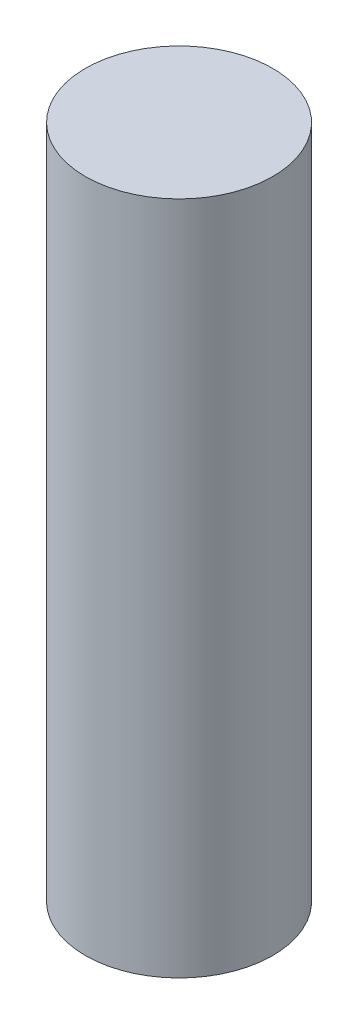
ISO-10303-21;
HEADER;
FILE_DESCRIPTION(('STEP AP214'),'2;1');
FILE_NAME('part.step','',(''),(''),'','','');
FILE_SCHEMA(('AUTOMOTIVE_DESIGN { 1 0 10303 214 1 1 1 1 }'));
ENDSEC;
DATA;
#1=APPLICATION_CONTEXT('core data for automotive mechanical design processes');
#2=APPLICATION_PROTOCOL_DEFINITION('international standard','automotive_design',2000,#1);
#3=PRODUCT_CONTEXT('',#1,'mechanical');
#4=PRODUCT('Part','Part','',(#3));
#5=PRODUCT_RELATED_PRODUCT_CATEGORY('part','',(#4));
#6=PRODUCT_DEFINITION_FORMATION('','',#4);
#7=PRODUCT_DEFINITION_CONTEXT('part definition',#1,'design');
#8=PRODUCT_DEFINITION('design','',#6,#7);
#9=PRODUCT_DEFINITION_SHAPE('','',#8);
#10=(LENGTH_UNIT() NAMED_UNIT(*) SI_UNIT(.MILLI.,.METRE.));
#11=(NAMED_UNIT(*) PLANE_ANGLE_UNIT() SI_UNIT($,.RADIAN.));
#12=(NAMED_UNIT(*) SI_UNIT($,.STERADIAN.) SOLID_ANGLE_UNIT());
#13=UNCERTAINTY_MEASURE_WITH_UNIT(LENGTH_MEASURE(1.E-05),#10,'distance_accuracy_value','');
#14=(GEOMETRIC_REPRESENTATION_CONTEXT(3) GLOBAL_UNCERTAINTY_ASSIGNED_CONTEXT((#13)) GLOBAL_UNIT_ASSIGNED_CONTEXT((#10,
#11,#12)) REPRESENTATION_CONTEXT('',''));
#15=CARTESIAN_POINT('',(0.,0.,0.));
#16=DIRECTION('',(0.,0.,1.));
#17=DIRECTION('',(1.,0.,0.));
#18=AXIS2_PLACEMENT_3D('',#15,#16,#17);
#19=CARTESIAN_POINT('',(0.,7.2,0.));
#20=DIRECTION('',(0.,1.,0.));
#21=DIRECTION('',(0.,0.,1.));
#22=AXIS2_PLACEMENT_3D('',#19,#20,#21);
#23=PLANE('',#22);
#24=CARTESIAN_POINT('',(0.,7.2,0.));
#25=DIRECTION('',(0.,1.,0.));
#26=DIRECTION('',(0.,0.,1.));
#27=AXIS2_PLACEMENT_3D('',#24,#25,#26);
#28=CIRCLE('',#27,1.);
#29=CARTESIAN_POINT('',(0.,7.2,1.));
#30=VERTEX_POINT('',#29);
#31=EDGE_CURVE('E18',#30,#30,#28,.F.);
#32=ORIENTED_EDGE('',*,*,#31,.F.);
#33=EDGE_LOOP('',(#32));
#34=FACE_BOUND('',#33,.T.);
#35=ADVANCED_FACE('F15',(#34),#23,.T.);
#36=CARTESIAN_POINT('',(0.,0.,0.));
#37=DIRECTION('',(0.,1.,0.));
#38=DIRECTION('',(0.,0.,1.));
#39=AXIS2_PLACEMENT_3D('',#36,#37,#38);
#40=PLANE('',#39);
#41=CARTESIAN_POINT('',(0.,0.,0.));
#42=DIRECTION('',(0.,1.,0.));
#43=DIRECTION('',(0.,0.,1.));
#44=AXIS2_PLACEMENT_3D('',#41,#42,#43);
#45=CIRCLE('',#44,1.);
#46=CARTESIAN_POINT('',(0.,0.,1.));
#47=VERTEX_POINT('',#46);
#48=EDGE_CURVE('E10',#47,#47,#45,.T.);
#49=ORIENTED_EDGE('',*,*,#48,.F.);
#50=EDGE_LOOP('',(#49));
#51=FACE_BOUND('',#50,.T.);
#52=ADVANCED_FACE('F30',(#51),#40,.F.);
#53=CARTESIAN_POINT('',(0.,0.,0.));
#54=DIRECTION('',(0.,1.,0.));
#55=DIRECTION('',(0.,0.,1.));
#56=AXIS2_PLACEMENT_3D('',#53,#54,#55);
#57=CYLINDRICAL_SURFACE('',#56,1.);
#58=ORIENTED_EDGE('',*,*,#31,.T.);
#59=EDGE_LOOP('',(#58));
#60=FACE_BOUND('',#59,.T.);
#61=ORIENTED_EDGE('',*,*,#48,.T.);
#62=EDGE_LOOP('',(#61));
#63=FACE_BOUND('',#62,.T.);
#64=ADVANCED_FACE('F27',(#60,#63),#57,.T.);
#65=CLOSED_SHELL('',(#35,#52,#64));
#66=MANIFOLD_SOLID_BREP('B1',#65);
#67=ADVANCED_BREP_SHAPE_REPRESENTATION('',(#18,#66),#14);
#68=SHAPE_DEFINITION_REPRESENTATION(#9,#67);
ENDSEC;
END-ISO-10303-21;
